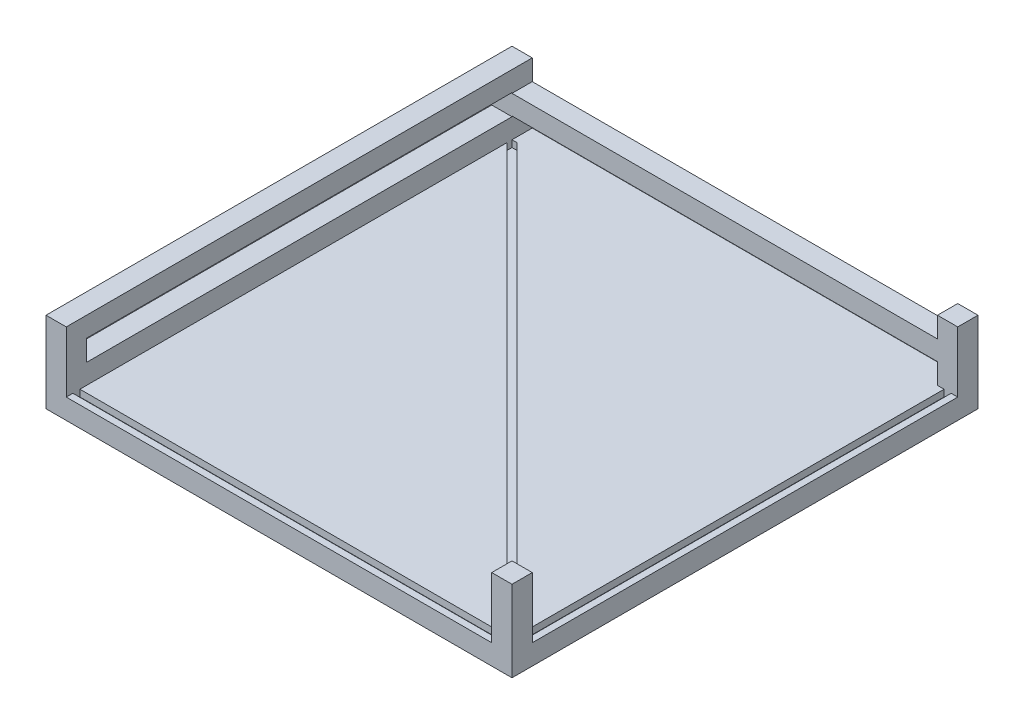
ISO-10303-21;
HEADER;
FILE_DESCRIPTION(('STEP AP214'),'2;1');
FILE_NAME('part.step','',(''),(''),'','','');
FILE_SCHEMA(('AUTOMOTIVE_DESIGN { 1 0 10303 214 1 1 1 1 }'));
ENDSEC;
DATA;
#1=APPLICATION_CONTEXT('core data for automotive mechanical design processes');
#2=APPLICATION_PROTOCOL_DEFINITION('international standard','automotive_design',2000,#1);
#3=PRODUCT_CONTEXT('',#1,'mechanical');
#4=PRODUCT('Part','Part','',(#3));
#5=PRODUCT_RELATED_PRODUCT_CATEGORY('part','',(#4));
#6=PRODUCT_DEFINITION_FORMATION('','',#4);
#7=PRODUCT_DEFINITION_CONTEXT('part definition',#1,'design');
#8=PRODUCT_DEFINITION('design','',#6,#7);
#9=PRODUCT_DEFINITION_SHAPE('','',#8);
#10=(LENGTH_UNIT() NAMED_UNIT(*) SI_UNIT(.MILLI.,.METRE.));
#11=(NAMED_UNIT(*) PLANE_ANGLE_UNIT() SI_UNIT($,.RADIAN.));
#12=(NAMED_UNIT(*) SI_UNIT($,.STERADIAN.) SOLID_ANGLE_UNIT());
#13=UNCERTAINTY_MEASURE_WITH_UNIT(LENGTH_MEASURE(1.E-05),#10,'distance_accuracy_value','');
#14=(GEOMETRIC_REPRESENTATION_CONTEXT(3) GLOBAL_UNCERTAINTY_ASSIGNED_CONTEXT((#13)) GLOBAL_UNIT_ASSIGNED_CONTEXT((#10,
#11,#12)) REPRESENTATION_CONTEXT('',''));
#15=CARTESIAN_POINT('',(0.,0.,0.));
#16=DIRECTION('',(0.,0.,1.));
#17=DIRECTION('',(1.,0.,0.));
#18=AXIS2_PLACEMENT_3D('',#15,#16,#17);
#19=CARTESIAN_POINT('',(0.,5.,0.));
#20=DIRECTION('',(0.,1.,0.));
#21=DIRECTION('',(0.,0.,1.));
#22=AXIS2_PLACEMENT_3D('',#19,#20,#21);
#23=PLANE('',#22);
#24=DIRECTION('',(0.707106781186548,0.,0.707106781186548));
#25=VECTOR('',#24,1.);
#26=CARTESIAN_POINT('',(-52.5,5.,-51.2649201555275));
#27=LINE('',#26,#25);
#28=CARTESIAN_POINT('',(-52.5,5.,-51.2649201555275));
#29=VERTEX_POINT('',#28);
#30=CARTESIAN_POINT('',(52.5,5.,53.7350798444725));
#31=VERTEX_POINT('',#30);
#32=EDGE_CURVE('E60',#29,#31,#27,.T.);
#33=ORIENTED_EDGE('',*,*,#32,.F.);
#34=DIRECTION('',(0.,0.,-1.));
#35=VECTOR('',#34,1.);
#36=CARTESIAN_POINT('',(-52.5,5.,0.));
#37=LINE('',#36,#35);
#38=CARTESIAN_POINT('',(-52.5,5.,54.1266666666667));
#39=VERTEX_POINT('',#38);
#40=EDGE_CURVE('E455',#39,#29,#37,.T.);
#41=ORIENTED_EDGE('',*,*,#40,.F.);
#42=DIRECTION('',(-1.,0.,0.));
#43=VECTOR('',#42,1.);
#44=CARTESIAN_POINT('',(52.5,5.,54.1266666666667));
#45=LINE('',#44,#43);
#46=CARTESIAN_POINT('',(52.5,5.,54.1266666666667));
#47=VERTEX_POINT('',#46);
#48=EDGE_CURVE('E324',#47,#39,#45,.T.);
#49=ORIENTED_EDGE('',*,*,#48,.F.);
#50=DIRECTION('',(0.,0.,-1.));
#51=VECTOR('',#50,1.);
#52=CARTESIAN_POINT('',(52.5,5.,57.5));
#53=LINE('',#52,#51);
#54=EDGE_CURVE('E371',#47,#31,#53,.T.);
#55=ORIENTED_EDGE('',*,*,#54,.T.);
#56=EDGE_LOOP('',(#33,#41,#49,#55));
#57=FACE_BOUND('',#56,.T.);
#58=ADVANCED_FACE('F45',(#57),#23,.T.);
#59=DIRECTION('',(-1.,0.,0.));
#60=VECTOR('',#59,1.);
#61=CARTESIAN_POINT('',(-52.5,5.,-52.5));
#62=LINE('',#61,#60);
#63=CARTESIAN_POINT('',(-51.2649201555275,5.,-52.5));
#64=VERTEX_POINT('',#63);
#65=CARTESIAN_POINT('',(-52.5,5.,-52.5));
#66=VERTEX_POINT('',#65);
#67=EDGE_CURVE('E287',#64,#66,#62,.T.);
#68=ORIENTED_EDGE('',*,*,#67,.F.);
#69=DIRECTION('',(-0.707106781186548,0.,-0.707106781186548));
#70=VECTOR('',#69,1.);
#71=CARTESIAN_POINT('',(53.7350798444725,5.,52.5));
#72=LINE('',#71,#70);
#73=CARTESIAN_POINT('',(53.7350798444725,5.,52.5));
#74=VERTEX_POINT('',#73);
#75=EDGE_CURVE('E297',#74,#64,#72,.T.);
#76=ORIENTED_EDGE('',*,*,#75,.F.);
#77=DIRECTION('',(-1.,0.,0.));
#78=VECTOR('',#77,1.);
#79=CARTESIAN_POINT('',(57.5,5.,52.5));
#80=LINE('',#79,#78);
#81=CARTESIAN_POINT('',(54.1266666666667,5.,52.5));
#82=VERTEX_POINT('',#81);
#83=EDGE_CURVE('E268',#82,#74,#80,.T.);
#84=ORIENTED_EDGE('',*,*,#83,.F.);
#85=DIRECTION('',(0.,0.,1.));
#86=VECTOR('',#85,1.);
#87=CARTESIAN_POINT('',(54.1266666666667,5.,-52.5));
#88=LINE('',#87,#86);
#89=CARTESIAN_POINT('',(54.1266666666667,5.,-52.5));
#90=VERTEX_POINT('',#89);
#91=EDGE_CURVE('E68',#90,#82,#88,.T.);
#92=ORIENTED_EDGE('',*,*,#91,.F.);
#93=DIRECTION('',(-1.,0.,0.));
#94=VECTOR('',#93,1.);
#95=CARTESIAN_POINT('',(57.5,5.,-52.5));
#96=LINE('',#95,#94);
#97=CARTESIAN_POINT('',(52.5,5.,-52.5));
#98=VERTEX_POINT('',#97);
#99=EDGE_CURVE('E389',#90,#98,#96,.T.);
#100=ORIENTED_EDGE('',*,*,#99,.T.);
#101=DIRECTION('',(0.,0.,-1.));
#102=VECTOR('',#101,1.);
#103=CARTESIAN_POINT('',(52.5,5.,-52.5));
#104=LINE('',#103,#102);
#105=CARTESIAN_POINT('',(52.5,5.,-57.5));
#106=VERTEX_POINT('',#105);
#107=EDGE_CURVE('E405',#98,#106,#104,.T.);
#108=ORIENTED_EDGE('',*,*,#107,.T.);
#109=DIRECTION('',(-1.,0.,0.));
#110=VECTOR('',#109,1.);
#111=CARTESIAN_POINT('',(-57.5,5.,-57.5));
#112=LINE('',#111,#110);
#113=CARTESIAN_POINT('',(-52.5,5.,-57.5));
#114=VERTEX_POINT('',#113);
#115=EDGE_CURVE('E495',#106,#114,#112,.T.);
#116=ORIENTED_EDGE('',*,*,#115,.T.);
#117=EDGE_CURVE('E450',#66,#114,#37,.T.);
#118=ORIENTED_EDGE('',*,*,#117,.F.);
#119=EDGE_LOOP('',(#68,#76,#84,#92,#100,#108,#116,#118));
#120=FACE_BOUND('',#119,.T.);
#121=ADVANCED_FACE('F558',(#120),#23,.T.);
#122=DIRECTION('',(1.,0.,0.));
#123=VECTOR('',#122,1.);
#124=CARTESIAN_POINT('',(52.5,5.,55.8733333333333));
#125=LINE('',#124,#123);
#126=CARTESIAN_POINT('',(-52.5,5.,55.8733333333333));
#127=VERTEX_POINT('',#126);
#128=CARTESIAN_POINT('',(52.5,5.,55.8733333333333));
#129=VERTEX_POINT('',#128);
#130=EDGE_CURVE('E343',#127,#129,#125,.T.);
#131=ORIENTED_EDGE('',*,*,#130,.F.);
#132=CARTESIAN_POINT('',(-52.5,5.,57.5));
#133=VERTEX_POINT('',#132);
#134=EDGE_CURVE('E451',#133,#127,#37,.T.);
#135=ORIENTED_EDGE('',*,*,#134,.F.);
#136=DIRECTION('',(1.,0.,0.));
#137=VECTOR('',#136,1.);
#138=CARTESIAN_POINT('',(-57.5,5.,57.5));
#139=LINE('',#138,#137);
#140=CARTESIAN_POINT('',(52.5,5.,57.5));
#141=VERTEX_POINT('',#140);
#142=EDGE_CURVE('E490',#133,#141,#139,.T.);
#143=ORIENTED_EDGE('',*,*,#142,.T.);
#144=EDGE_CURVE('E372',#141,#129,#53,.T.);
#145=ORIENTED_EDGE('',*,*,#144,.T.);
#146=EDGE_LOOP('',(#131,#135,#143,#145));
#147=FACE_BOUND('',#146,.T.);
#148=ADVANCED_FACE('F565',(#147),#23,.T.);
#149=DIRECTION('',(0.,0.,-1.));
#150=VECTOR('',#149,1.);
#151=CARTESIAN_POINT('',(55.8733333333333,5.,-52.5));
#152=LINE('',#151,#150);
#153=CARTESIAN_POINT('',(55.8733333333334,5.,52.5));
#154=VERTEX_POINT('',#153);
#155=CARTESIAN_POINT('',(55.8733333333333,5.,-52.5));
#156=VERTEX_POINT('',#155);
#157=EDGE_CURVE('E313',#154,#156,#152,.T.);
#158=ORIENTED_EDGE('',*,*,#157,.F.);
#159=CARTESIAN_POINT('',(57.5,5.,52.5));
#160=VERTEX_POINT('',#159);
#161=EDGE_CURVE('E368',#160,#154,#80,.T.);
#162=ORIENTED_EDGE('',*,*,#161,.F.);
#163=DIRECTION('',(0.,0.,-1.));
#164=VECTOR('',#163,1.);
#165=CARTESIAN_POINT('',(57.5,5.,-57.5));
#166=LINE('',#165,#164);
#167=CARTESIAN_POINT('',(57.5,5.,-52.5));
#168=VERTEX_POINT('',#167);
#169=EDGE_CURVE('E492',#160,#168,#166,.T.);
#170=ORIENTED_EDGE('',*,*,#169,.T.);
#171=EDGE_CURVE('E385',#168,#156,#96,.T.);
#172=ORIENTED_EDGE('',*,*,#171,.T.);
#173=EDGE_LOOP('',(#158,#162,#170,#172));
#174=FACE_BOUND('',#173,.T.);
#175=ADVANCED_FACE('F539',(#174),#23,.T.);
#176=CARTESIAN_POINT('',(-57.5,5.,-57.5));
#177=DIRECTION('',(1.,0.,0.));
#178=DIRECTION('',(0.,0.,-1.));
#179=AXIS2_PLACEMENT_3D('',#176,#177,#178);
#180=PLANE('',#179);
#181=DIRECTION('',(0.,-1.,0.));
#182=VECTOR('',#181,1.);
#183=CARTESIAN_POINT('',(-57.5,5.,-57.5));
#184=LINE('',#183,#182);
#185=CARTESIAN_POINT('',(-57.5,20.,-57.5));
#186=VERTEX_POINT('',#185);
#187=CARTESIAN_POINT('',(-57.5,0.,-57.5));
#188=VERTEX_POINT('',#187);
#189=EDGE_CURVE('E498',#186,#188,#184,.T.);
#190=ORIENTED_EDGE('',*,*,#189,.T.);
#191=DIRECTION('',(0.,0.,1.));
#192=VECTOR('',#191,1.);
#193=CARTESIAN_POINT('',(-57.5,0.,-57.5));
#194=LINE('',#193,#192);
#195=CARTESIAN_POINT('',(-57.5,0.,57.5));
#196=VERTEX_POINT('',#195);
#197=EDGE_CURVE('E478',#188,#196,#194,.T.);
#198=ORIENTED_EDGE('',*,*,#197,.T.);
#199=DIRECTION('',(0.,-1.,0.));
#200=VECTOR('',#199,1.);
#201=CARTESIAN_POINT('',(-57.5,5.,57.5));
#202=LINE('',#201,#200);
#203=CARTESIAN_POINT('',(-57.5,20.,57.5));
#204=VERTEX_POINT('',#203);
#205=EDGE_CURVE('E11',#204,#196,#202,.T.);
#206=ORIENTED_EDGE('',*,*,#205,.F.);
#207=DIRECTION('',(0.,0.,1.));
#208=VECTOR('',#207,1.);
#209=CARTESIAN_POINT('',(-57.5,20.,0.));
#210=LINE('',#209,#208);
#211=EDGE_CURVE('E441',#186,#204,#210,.T.);
#212=ORIENTED_EDGE('',*,*,#211,.F.);
#213=EDGE_LOOP('',(#190,#198,#206,#212));
#214=FACE_BOUND('',#213,.T.);
#215=DIRECTION('',(0.,1.,0.));
#216=VECTOR('',#215,1.);
#217=CARTESIAN_POINT('',(-57.5,0.,-52.5));
#218=LINE('',#217,#216);
#219=CARTESIAN_POINT('',(-57.5,9.92,-52.5));
#220=VERTEX_POINT('',#219);
#221=CARTESIAN_POINT('',(-57.5,15.08,-52.5));
#222=VERTEX_POINT('',#221);
#223=EDGE_CURVE('E468',#220,#222,#218,.T.);
#224=ORIENTED_EDGE('',*,*,#223,.T.);
#225=DIRECTION('',(0.,0.,1.));
#226=VECTOR('',#225,1.);
#227=CARTESIAN_POINT('',(-57.5,15.08,0.));
#228=LINE('',#227,#226);
#229=CARTESIAN_POINT('',(-57.5,15.08,52.5));
#230=VERTEX_POINT('',#229);
#231=EDGE_CURVE('E471',#222,#230,#228,.T.);
#232=ORIENTED_EDGE('',*,*,#231,.T.);
#233=DIRECTION('',(0.,1.,0.));
#234=VECTOR('',#233,1.);
#235=CARTESIAN_POINT('',(-57.5,0.,52.5));
#236=LINE('',#235,#234);
#237=CARTESIAN_POINT('',(-57.5,9.92,52.5));
#238=VERTEX_POINT('',#237);
#239=EDGE_CURVE('E423',#238,#230,#236,.T.);
#240=ORIENTED_EDGE('',*,*,#239,.F.);
#241=DIRECTION('',(0.,0.,1.));
#242=VECTOR('',#241,1.);
#243=CARTESIAN_POINT('',(-57.5,9.92,0.));
#244=LINE('',#243,#242);
#245=EDGE_CURVE('E466',#220,#238,#244,.T.);
#246=ORIENTED_EDGE('',*,*,#245,.F.);
#247=EDGE_LOOP('',(#224,#232,#240,#246));
#248=FACE_BOUND('',#247,.T.);
#249=ADVANCED_FACE('F47',(#214,#248),#180,.F.);
#250=CARTESIAN_POINT('',(-57.5,5.,57.5));
#251=DIRECTION('',(0.,0.,-1.));
#252=DIRECTION('',(-1.,0.,0.));
#253=AXIS2_PLACEMENT_3D('',#250,#251,#252);
#254=PLANE('',#253);
#255=DIRECTION('',(1.,0.,0.));
#256=VECTOR('',#255,1.);
#257=CARTESIAN_POINT('',(-57.5,0.,57.5));
#258=LINE('',#257,#256);
#259=CARTESIAN_POINT('',(57.5,0.,57.5));
#260=VERTEX_POINT('',#259);
#261=EDGE_CURVE('E501',#196,#260,#258,.T.);
#262=ORIENTED_EDGE('',*,*,#261,.T.);
#263=DIRECTION('',(0.,-1.,0.));
#264=VECTOR('',#263,1.);
#265=CARTESIAN_POINT('',(57.5,5.,57.5));
#266=LINE('',#265,#264);
#267=CARTESIAN_POINT('',(57.5,20.,57.5));
#268=VERTEX_POINT('',#267);
#269=EDGE_CURVE('E53',#268,#260,#266,.T.);
#270=ORIENTED_EDGE('',*,*,#269,.F.);
#271=DIRECTION('',(1.,0.,0.));
#272=VECTOR('',#271,1.);
#273=CARTESIAN_POINT('',(57.5,20.,57.5));
#274=LINE('',#273,#272);
#275=CARTESIAN_POINT('',(52.5,20.,57.5));
#276=VERTEX_POINT('',#275);
#277=EDGE_CURVE('E367',#276,#268,#274,.T.);
#278=ORIENTED_EDGE('',*,*,#277,.F.);
#279=DIRECTION('',(0.,-1.,0.));
#280=VECTOR('',#279,1.);
#281=CARTESIAN_POINT('',(52.5,27.0710678118655,57.5));
#282=LINE('',#281,#280);
#283=EDGE_CURVE('E375',#276,#141,#282,.T.);
#284=ORIENTED_EDGE('',*,*,#283,.T.);
#285=ORIENTED_EDGE('',*,*,#142,.F.);
#286=DIRECTION('',(0.,1.,0.));
#287=VECTOR('',#286,1.);
#288=CARTESIAN_POINT('',(-52.5,0.,57.5));
#289=LINE('',#288,#287);
#290=CARTESIAN_POINT('',(-52.5,20.,57.5));
#291=VERTEX_POINT('',#290);
#292=EDGE_CURVE('E454',#133,#291,#289,.T.);
#293=ORIENTED_EDGE('',*,*,#292,.T.);
#294=DIRECTION('',(-1.,0.,0.));
#295=VECTOR('',#294,1.);
#296=CARTESIAN_POINT('',(-52.5,20.,57.5));
#297=LINE('',#296,#295);
#298=EDGE_CURVE('E479',#291,#204,#297,.T.);
#299=ORIENTED_EDGE('',*,*,#298,.T.);
#300=ORIENTED_EDGE('',*,*,#205,.T.);
#301=EDGE_LOOP('',(#262,#270,#278,#284,#285,#293,#299,#300));
#302=FACE_BOUND('',#301,.T.);
#303=ADVANCED_FACE('F548',(#302),#254,.F.);
#304=CARTESIAN_POINT('',(57.5,5.,-57.5));
#305=DIRECTION('',(-1.,0.,0.));
#306=DIRECTION('',(0.,0.,1.));
#307=AXIS2_PLACEMENT_3D('',#304,#305,#306);
#308=PLANE('',#307);
#309=DIRECTION('',(0.,0.,-1.));
#310=VECTOR('',#309,1.);
#311=CARTESIAN_POINT('',(57.5,0.,-57.5));
#312=LINE('',#311,#310);
#313=CARTESIAN_POINT('',(57.5,0.,-57.5));
#314=VERTEX_POINT('',#313);
#315=EDGE_CURVE('E503',#260,#314,#312,.T.);
#316=ORIENTED_EDGE('',*,*,#315,.T.);
#317=DIRECTION('',(0.,-1.,0.));
#318=VECTOR('',#317,1.);
#319=CARTESIAN_POINT('',(57.5,5.,-57.5));
#320=LINE('',#319,#318);
#321=CARTESIAN_POINT('',(57.5,20.,-57.5));
#322=VERTEX_POINT('',#321);
#323=EDGE_CURVE('E508',#322,#314,#320,.T.);
#324=ORIENTED_EDGE('',*,*,#323,.F.);
#325=DIRECTION('',(0.,0.,-1.));
#326=VECTOR('',#325,1.);
#327=CARTESIAN_POINT('',(57.5,20.,-52.5));
#328=LINE('',#327,#326);
#329=CARTESIAN_POINT('',(57.5,20.,-52.5));
#330=VERTEX_POINT('',#329);
#331=EDGE_CURVE('E420',#330,#322,#328,.T.);
#332=ORIENTED_EDGE('',*,*,#331,.F.);
#333=DIRECTION('',(0.,1.,0.));
#334=VECTOR('',#333,1.);
#335=CARTESIAN_POINT('',(57.5,5.,-52.5));
#336=LINE('',#335,#334);
#337=EDGE_CURVE('E403',#168,#330,#336,.T.);
#338=ORIENTED_EDGE('',*,*,#337,.F.);
#339=ORIENTED_EDGE('',*,*,#169,.F.);
#340=DIRECTION('',(0.,-1.,0.));
#341=VECTOR('',#340,1.);
#342=CARTESIAN_POINT('',(57.5,27.0710678118655,52.5));
#343=LINE('',#342,#341);
#344=CARTESIAN_POINT('',(57.5,20.,52.5));
#345=VERTEX_POINT('',#344);
#346=EDGE_CURVE('E361',#345,#160,#343,.T.);
#347=ORIENTED_EDGE('',*,*,#346,.F.);
#348=DIRECTION('',(0.,0.,1.));
#349=VECTOR('',#348,1.);
#350=CARTESIAN_POINT('',(57.5,20.,57.5));
#351=LINE('',#350,#349);
#352=EDGE_CURVE('E364',#345,#268,#351,.T.);
#353=ORIENTED_EDGE('',*,*,#352,.T.);
#354=ORIENTED_EDGE('',*,*,#269,.T.);
#355=EDGE_LOOP('',(#316,#324,#332,#338,#339,#347,#353,#354));
#356=FACE_BOUND('',#355,.T.);
#357=ADVANCED_FACE('F513',(#356),#308,.F.);
#358=CARTESIAN_POINT('',(-57.5,5.,-57.5));
#359=DIRECTION('',(0.,0.,1.));
#360=DIRECTION('',(1.,0.,0.));
#361=AXIS2_PLACEMENT_3D('',#358,#359,#360);
#362=PLANE('',#361);
#363=DIRECTION('',(0.,1.,0.));
#364=VECTOR('',#363,1.);
#365=CARTESIAN_POINT('',(-52.5,0.,-57.5));
#366=LINE('',#365,#364);
#367=CARTESIAN_POINT('',(-52.5,10.08,-57.5));
#368=VERTEX_POINT('',#367);
#369=EDGE_CURVE('E461',#114,#368,#366,.T.);
#370=ORIENTED_EDGE('',*,*,#369,.F.);
#371=ORIENTED_EDGE('',*,*,#115,.F.);
#372=DIRECTION('',(0.,-1.,0.));
#373=VECTOR('',#372,1.);
#374=CARTESIAN_POINT('',(52.5,10.08,-57.5));
#375=LINE('',#374,#373);
#376=CARTESIAN_POINT('',(52.5,10.08,-57.5));
#377=VERTEX_POINT('',#376);
#378=EDGE_CURVE('E384',#377,#106,#375,.T.);
#379=ORIENTED_EDGE('',*,*,#378,.F.);
#380=DIRECTION('',(-1.,0.,0.));
#381=VECTOR('',#380,1.);
#382=CARTESIAN_POINT('',(52.5,10.08,-57.5));
#383=LINE('',#382,#381);
#384=EDGE_CURVE('E408',#377,#368,#383,.T.);
#385=ORIENTED_EDGE('',*,*,#384,.T.);
#386=EDGE_LOOP('',(#370,#371,#379,#385));
#387=FACE_BOUND('',#386,.T.);
#388=DIRECTION('',(-1.,0.,0.));
#389=VECTOR('',#388,1.);
#390=CARTESIAN_POINT('',(-57.5,0.,-57.5));
#391=LINE('',#390,#389);
#392=EDGE_CURVE('E493',#314,#188,#391,.T.);
#393=ORIENTED_EDGE('',*,*,#392,.T.);
#394=ORIENTED_EDGE('',*,*,#189,.F.);
#395=DIRECTION('',(-1.,0.,0.));
#396=VECTOR('',#395,1.);
#397=CARTESIAN_POINT('',(-52.5,20.,-57.5));
#398=LINE('',#397,#396);
#399=CARTESIAN_POINT('',(-52.5,20.,-57.5));
#400=VERTEX_POINT('',#399);
#401=EDGE_CURVE('E475',#400,#186,#398,.T.);
#402=ORIENTED_EDGE('',*,*,#401,.F.);
#403=CARTESIAN_POINT('',(-52.5,14.92,-57.5));
#404=VERTEX_POINT('',#403);
#405=EDGE_CURVE('E460',#404,#400,#366,.T.);
#406=ORIENTED_EDGE('',*,*,#405,.F.);
#407=DIRECTION('',(-1.,0.,0.));
#408=VECTOR('',#407,1.);
#409=CARTESIAN_POINT('',(52.5,14.92,-57.5));
#410=LINE('',#409,#408);
#411=CARTESIAN_POINT('',(52.5,14.92,-57.5));
#412=VERTEX_POINT('',#411);
#413=EDGE_CURVE('E411',#412,#404,#410,.T.);
#414=ORIENTED_EDGE('',*,*,#413,.F.);
#415=DIRECTION('',(0.,1.,0.));
#416=VECTOR('',#415,1.);
#417=CARTESIAN_POINT('',(52.5,14.92,-57.5));
#418=LINE('',#417,#416);
#419=CARTESIAN_POINT('',(52.5,20.,-57.5));
#420=VERTEX_POINT('',#419);
#421=EDGE_CURVE('E414',#412,#420,#418,.T.);
#422=ORIENTED_EDGE('',*,*,#421,.T.);
#423=DIRECTION('',(-1.,0.,0.));
#424=VECTOR('',#423,1.);
#425=CARTESIAN_POINT('',(57.5,20.,-57.5));
#426=LINE('',#425,#424);
#427=EDGE_CURVE('E417',#322,#420,#426,.T.);
#428=ORIENTED_EDGE('',*,*,#427,.F.);
#429=ORIENTED_EDGE('',*,*,#323,.T.);
#430=EDGE_LOOP('',(#393,#394,#402,#406,#414,#422,#428,#429));
#431=FACE_BOUND('',#430,.T.);
#432=ADVANCED_FACE('F522',(#387,#431),#362,.F.);
#433=CARTESIAN_POINT('',(0.,0.,0.));
#434=DIRECTION('',(0.,1.,0.));
#435=DIRECTION('',(0.,0.,1.));
#436=AXIS2_PLACEMENT_3D('',#433,#434,#435);
#437=PLANE('',#436);
#438=ORIENTED_EDGE('',*,*,#197,.F.);
#439=ORIENTED_EDGE('',*,*,#392,.F.);
#440=ORIENTED_EDGE('',*,*,#315,.F.);
#441=ORIENTED_EDGE('',*,*,#261,.F.);
#442=EDGE_LOOP('',(#438,#439,#440,#441));
#443=FACE_BOUND('',#442,.T.);
#444=ADVANCED_FACE('F520',(#443),#437,.F.);
#445=CARTESIAN_POINT('',(-52.5,20.,0.));
#446=DIRECTION('',(0.,-1.,0.));
#447=DIRECTION('',(0.,0.,-1.));
#448=AXIS2_PLACEMENT_3D('',#445,#446,#447);
#449=PLANE('',#448);
#450=ORIENTED_EDGE('',*,*,#298,.F.);
#451=DIRECTION('',(0.,0.,1.));
#452=VECTOR('',#451,1.);
#453=CARTESIAN_POINT('',(-52.5,20.,0.));
#454=LINE('',#453,#452);
#455=EDGE_CURVE('E458',#400,#291,#454,.T.);
#456=ORIENTED_EDGE('',*,*,#455,.F.);
#457=ORIENTED_EDGE('',*,*,#401,.T.);
#458=ORIENTED_EDGE('',*,*,#211,.T.);
#459=EDGE_LOOP('',(#450,#456,#457,#458));
#460=FACE_BOUND('',#459,.T.);
#461=ADVANCED_FACE('F588',(#460),#449,.F.);
#462=CARTESIAN_POINT('',(-52.5,0.,52.5));
#463=DIRECTION('',(0.,0.,1.));
#464=DIRECTION('',(1.,0.,0.));
#465=AXIS2_PLACEMENT_3D('',#462,#463,#464);
#466=PLANE('',#465);
#467=ORIENTED_EDGE('',*,*,#239,.T.);
#468=DIRECTION('',(-1.,0.,0.));
#469=VECTOR('',#468,1.);
#470=CARTESIAN_POINT('',(-52.5,15.08,52.5));
#471=LINE('',#470,#469);
#472=CARTESIAN_POINT('',(-52.5,15.08,52.5));
#473=VERTEX_POINT('',#472);
#474=EDGE_CURVE('E482',#473,#230,#471,.T.);
#475=ORIENTED_EDGE('',*,*,#474,.F.);
#476=DIRECTION('',(0.,1.,0.));
#477=VECTOR('',#476,1.);
#478=CARTESIAN_POINT('',(-52.5,0.,52.5));
#479=LINE('',#478,#477);
#480=CARTESIAN_POINT('',(-52.5,9.92,52.5));
#481=VERTEX_POINT('',#480);
#482=EDGE_CURVE('E438',#481,#473,#479,.T.);
#483=ORIENTED_EDGE('',*,*,#482,.F.);
#484=DIRECTION('',(-1.,0.,0.));
#485=VECTOR('',#484,1.);
#486=CARTESIAN_POINT('',(-52.5,9.92,52.5));
#487=LINE('',#486,#485);
#488=EDGE_CURVE('E463',#481,#238,#487,.T.);
#489=ORIENTED_EDGE('',*,*,#488,.T.);
#490=EDGE_LOOP('',(#467,#475,#483,#489));
#491=FACE_BOUND('',#490,.T.);
#492=ADVANCED_FACE('F601',(#491),#466,.F.);
#493=CARTESIAN_POINT('',(-52.5,15.08,0.));
#494=DIRECTION('',(0.,-1.,0.));
#495=DIRECTION('',(0.,0.,-1.));
#496=AXIS2_PLACEMENT_3D('',#493,#494,#495);
#497=PLANE('',#496);
#498=ORIENTED_EDGE('',*,*,#231,.F.);
#499=DIRECTION('',(-1.,0.,0.));
#500=VECTOR('',#499,1.);
#501=CARTESIAN_POINT('',(-52.5,15.08,-52.5));
#502=LINE('',#501,#500);
#503=CARTESIAN_POINT('',(-52.5,15.08,-52.5));
#504=VERTEX_POINT('',#503);
#505=EDGE_CURVE('E484',#504,#222,#502,.T.);
#506=ORIENTED_EDGE('',*,*,#505,.F.);
#507=DIRECTION('',(0.,0.,1.));
#508=VECTOR('',#507,1.);
#509=CARTESIAN_POINT('',(-52.5,15.08,0.));
#510=LINE('',#509,#508);
#511=EDGE_CURVE('E447',#504,#473,#510,.T.);
#512=ORIENTED_EDGE('',*,*,#511,.T.);
#513=ORIENTED_EDGE('',*,*,#474,.T.);
#514=EDGE_LOOP('',(#498,#506,#512,#513));
#515=FACE_BOUND('',#514,.T.);
#516=ADVANCED_FACE('F596',(#515),#497,.T.);
#517=CARTESIAN_POINT('',(-52.5,0.,-52.5));
#518=DIRECTION('',(0.,0.,1.));
#519=DIRECTION('',(1.,0.,0.));
#520=AXIS2_PLACEMENT_3D('',#517,#518,#519);
#521=PLANE('',#520);
#522=ORIENTED_EDGE('',*,*,#223,.F.);
#523=DIRECTION('',(-1.,0.,0.));
#524=VECTOR('',#523,1.);
#525=CARTESIAN_POINT('',(-52.5,9.92,-52.5));
#526=LINE('',#525,#524);
#527=CARTESIAN_POINT('',(-52.5,9.92,-52.5));
#528=VERTEX_POINT('',#527);
#529=EDGE_CURVE('E486',#528,#220,#526,.T.);
#530=ORIENTED_EDGE('',*,*,#529,.F.);
#531=DIRECTION('',(0.,1.,0.));
#532=VECTOR('',#531,1.);
#533=CARTESIAN_POINT('',(-52.5,0.,-52.5));
#534=LINE('',#533,#532);
#535=CARTESIAN_POINT('',(-52.5,10.08,-52.5));
#536=VERTEX_POINT('',#535);
#537=EDGE_CURVE('E444',#528,#536,#534,.T.);
#538=ORIENTED_EDGE('',*,*,#537,.T.);
#539=DIRECTION('',(-1.,0.,0.));
#540=VECTOR('',#539,1.);
#541=CARTESIAN_POINT('',(52.5,10.08,-52.5));
#542=LINE('',#541,#540);
#543=CARTESIAN_POINT('',(52.5,10.08,-52.5));
#544=VERTEX_POINT('',#543);
#545=EDGE_CURVE('E392',#544,#536,#542,.T.);
#546=ORIENTED_EDGE('',*,*,#545,.F.);
#547=DIRECTION('',(0.,-1.,0.));
#548=VECTOR('',#547,1.);
#549=CARTESIAN_POINT('',(52.5,10.08,-52.5));
#550=LINE('',#549,#548);
#551=EDGE_CURVE('E388',#544,#98,#550,.T.);
#552=ORIENTED_EDGE('',*,*,#551,.T.);
#553=ORIENTED_EDGE('',*,*,#99,.F.);
#554=DIRECTION('',(0.,1.,0.));
#555=VECTOR('',#554,1.);
#556=CARTESIAN_POINT('',(54.1266666666667,3.33333333333333,-52.5));
#557=LINE('',#556,#555);
#558=CARTESIAN_POINT('',(54.1266666666667,3.33333333333333,-52.5));
#559=VERTEX_POINT('',#558);
#560=EDGE_CURVE('E327',#559,#90,#557,.T.);
#561=ORIENTED_EDGE('',*,*,#560,.F.);
#562=DIRECTION('',(-1.,0.,0.));
#563=VECTOR('',#562,1.);
#564=CARTESIAN_POINT('',(54.1266666666667,3.33333333333333,-52.5));
#565=LINE('',#564,#563);
#566=CARTESIAN_POINT('',(55.8733333333333,3.33333333333333,-52.5));
#567=VERTEX_POINT('',#566);
#568=EDGE_CURVE('E319',#567,#559,#565,.T.);
#569=ORIENTED_EDGE('',*,*,#568,.F.);
#570=DIRECTION('',(0.,1.,0.));
#571=VECTOR('',#570,1.);
#572=CARTESIAN_POINT('',(55.8733333333333,3.33333333333333,-52.5));
#573=LINE('',#572,#571);
#574=EDGE_CURVE('E329',#567,#156,#573,.T.);
#575=ORIENTED_EDGE('',*,*,#574,.T.);
#576=ORIENTED_EDGE('',*,*,#171,.F.);
#577=ORIENTED_EDGE('',*,*,#337,.T.);
#578=DIRECTION('',(-1.,0.,0.));
#579=VECTOR('',#578,1.);
#580=CARTESIAN_POINT('',(57.5,20.,-52.5));
#581=LINE('',#580,#579);
#582=CARTESIAN_POINT('',(52.5,20.,-52.5));
#583=VERTEX_POINT('',#582);
#584=EDGE_CURVE('E401',#330,#583,#581,.T.);
#585=ORIENTED_EDGE('',*,*,#584,.T.);
#586=DIRECTION('',(0.,1.,0.));
#587=VECTOR('',#586,1.);
#588=CARTESIAN_POINT('',(52.5,14.92,-52.5));
#589=LINE('',#588,#587);
#590=CARTESIAN_POINT('',(52.5,14.92,-52.5));
#591=VERTEX_POINT('',#590);
#592=EDGE_CURVE('E398',#591,#583,#589,.T.);
#593=ORIENTED_EDGE('',*,*,#592,.F.);
#594=DIRECTION('',(-1.,0.,0.));
#595=VECTOR('',#594,1.);
#596=CARTESIAN_POINT('',(52.5,14.92,-52.5));
#597=LINE('',#596,#595);
#598=CARTESIAN_POINT('',(-52.5,14.92,-52.5));
#599=VERTEX_POINT('',#598);
#600=EDGE_CURVE('E395',#591,#599,#597,.T.);
#601=ORIENTED_EDGE('',*,*,#600,.T.);
#602=EDGE_CURVE('E443',#599,#504,#534,.T.);
#603=ORIENTED_EDGE('',*,*,#602,.T.);
#604=ORIENTED_EDGE('',*,*,#505,.T.);
#605=EDGE_LOOP('',(#522,#530,#538,#546,#552,#553,#561,#569,#575,#576,#577,#585,#593,#601,#603,#604));
#606=FACE_BOUND('',#605,.T.);
#607=ADVANCED_FACE('F534',(#606),#521,.T.);
#608=CARTESIAN_POINT('',(-52.5,9.92,0.));
#609=DIRECTION('',(0.,-1.,0.));
#610=DIRECTION('',(0.,0.,-1.));
#611=AXIS2_PLACEMENT_3D('',#608,#609,#610);
#612=PLANE('',#611);
#613=ORIENTED_EDGE('',*,*,#245,.T.);
#614=ORIENTED_EDGE('',*,*,#488,.F.);
#615=DIRECTION('',(0.,0.,1.));
#616=VECTOR('',#615,1.);
#617=CARTESIAN_POINT('',(-52.5,9.92,0.));
#618=LINE('',#617,#616);
#619=EDGE_CURVE('E440',#528,#481,#618,.T.);
#620=ORIENTED_EDGE('',*,*,#619,.F.);
#621=ORIENTED_EDGE('',*,*,#529,.T.);
#622=EDGE_LOOP('',(#613,#614,#620,#621));
#623=FACE_BOUND('',#622,.T.);
#624=ADVANCED_FACE('F605',(#623),#612,.F.);
#625=CARTESIAN_POINT('',(-52.5,0.,0.));
#626=DIRECTION('',(-1.,0.,0.));
#627=DIRECTION('',(0.,0.,1.));
#628=AXIS2_PLACEMENT_3D('',#625,#626,#627);
#629=PLANE('',#628);
#630=ORIENTED_EDGE('',*,*,#134,.T.);
#631=DIRECTION('',(0.,1.,0.));
#632=VECTOR('',#631,1.);
#633=CARTESIAN_POINT('',(-52.5,3.33333333333333,55.8733333333333));
#634=LINE('',#633,#632);
#635=CARTESIAN_POINT('',(-52.5,3.33333333333333,55.8733333333333));
#636=VERTEX_POINT('',#635);
#637=EDGE_CURVE('E339',#636,#127,#634,.T.);
#638=ORIENTED_EDGE('',*,*,#637,.F.);
#639=DIRECTION('',(0.,0.,1.));
#640=VECTOR('',#639,1.);
#641=CARTESIAN_POINT('',(-52.5,3.33333333333333,54.1266666666667));
#642=LINE('',#641,#640);
#643=CARTESIAN_POINT('',(-52.5,3.33333333333333,54.1266666666667));
#644=VERTEX_POINT('',#643);
#645=EDGE_CURVE('E350',#644,#636,#642,.T.);
#646=ORIENTED_EDGE('',*,*,#645,.F.);
#647=DIRECTION('',(0.,1.,0.));
#648=VECTOR('',#647,1.);
#649=CARTESIAN_POINT('',(-52.5,3.33333333333333,54.1266666666667));
#650=LINE('',#649,#648);
#651=EDGE_CURVE('E337',#644,#39,#650,.T.);
#652=ORIENTED_EDGE('',*,*,#651,.T.);
#653=ORIENTED_EDGE('',*,*,#40,.T.);
#654=DIRECTION('',(0.,1.,0.));
#655=VECTOR('',#654,1.);
#656=CARTESIAN_POINT('',(-52.5,3.33,-51.2649201555275));
#657=LINE('',#656,#655);
#658=CARTESIAN_POINT('',(-52.5,3.33,-51.2649201555275));
#659=VERTEX_POINT('',#658);
#660=EDGE_CURVE('E304',#659,#29,#657,.T.);
#661=ORIENTED_EDGE('',*,*,#660,.F.);
#662=DIRECTION('',(0.,0.,1.));
#663=VECTOR('',#662,1.);
#664=CARTESIAN_POINT('',(-52.5,3.33,-51.2649201555275));
#665=LINE('',#664,#663);
#666=CARTESIAN_POINT('',(-52.5,3.33,-52.5));
#667=VERTEX_POINT('',#666);
#668=EDGE_CURVE('E291',#667,#659,#665,.T.);
#669=ORIENTED_EDGE('',*,*,#668,.F.);
#670=DIRECTION('',(0.,1.,0.));
#671=VECTOR('',#670,1.);
#672=CARTESIAN_POINT('',(-52.5,3.33,-52.5));
#673=LINE('',#672,#671);
#674=EDGE_CURVE('E306',#667,#66,#673,.T.);
#675=ORIENTED_EDGE('',*,*,#674,.T.);
#676=ORIENTED_EDGE('',*,*,#117,.T.);
#677=ORIENTED_EDGE('',*,*,#369,.T.);
#678=DIRECTION('',(0.,0.,-1.));
#679=VECTOR('',#678,1.);
#680=CARTESIAN_POINT('',(-52.5,10.08,-52.5));
#681=LINE('',#680,#679);
#682=EDGE_CURVE('E431',#536,#368,#681,.T.);
#683=ORIENTED_EDGE('',*,*,#682,.F.);
#684=ORIENTED_EDGE('',*,*,#537,.F.);
#685=ORIENTED_EDGE('',*,*,#619,.T.);
#686=ORIENTED_EDGE('',*,*,#482,.T.);
#687=ORIENTED_EDGE('',*,*,#511,.F.);
#688=ORIENTED_EDGE('',*,*,#602,.F.);
#689=DIRECTION('',(0.,0.,-1.));
#690=VECTOR('',#689,1.);
#691=CARTESIAN_POINT('',(-52.5,14.92,-52.5));
#692=LINE('',#691,#690);
#693=EDGE_CURVE('E428',#599,#404,#692,.T.);
#694=ORIENTED_EDGE('',*,*,#693,.T.);
#695=ORIENTED_EDGE('',*,*,#405,.T.);
#696=ORIENTED_EDGE('',*,*,#455,.T.);
#697=ORIENTED_EDGE('',*,*,#292,.F.);
#698=EDGE_LOOP('',(#630,#638,#646,#652,#653,#661,#669,#675,#676,#677,#683,#684,#685,#686,#687,
#688,#694,#695,#696,#697));
#699=FACE_BOUND('',#698,.T.);
#700=ADVANCED_FACE('F582',(#699),#629,.F.);
#701=CARTESIAN_POINT('',(57.5,20.,-52.5));
#702=DIRECTION('',(0.,-1.,0.));
#703=DIRECTION('',(1.,0.,0.));
#704=AXIS2_PLACEMENT_3D('',#701,#702,#703);
#705=PLANE('',#704);
#706=ORIENTED_EDGE('',*,*,#427,.T.);
#707=DIRECTION('',(0.,0.,-1.));
#708=VECTOR('',#707,1.);
#709=CARTESIAN_POINT('',(52.5,20.,-52.5));
#710=LINE('',#709,#708);
#711=EDGE_CURVE('E424',#583,#420,#710,.T.);
#712=ORIENTED_EDGE('',*,*,#711,.F.);
#713=ORIENTED_EDGE('',*,*,#584,.F.);
#714=ORIENTED_EDGE('',*,*,#331,.T.);
#715=EDGE_LOOP('',(#706,#712,#713,#714));
#716=FACE_BOUND('',#715,.T.);
#717=ADVANCED_FACE('F529',(#716),#705,.F.);
#718=CARTESIAN_POINT('',(52.5,14.92,-52.5));
#719=DIRECTION('',(-1.,0.,0.));
#720=DIRECTION('',(0.,0.,1.));
#721=AXIS2_PLACEMENT_3D('',#718,#719,#720);
#722=PLANE('',#721);
#723=ORIENTED_EDGE('',*,*,#421,.F.);
#724=DIRECTION('',(0.,0.,-1.));
#725=VECTOR('',#724,1.);
#726=CARTESIAN_POINT('',(52.5,14.92,-52.5));
#727=LINE('',#726,#725);
#728=EDGE_CURVE('E426',#591,#412,#727,.T.);
#729=ORIENTED_EDGE('',*,*,#728,.F.);
#730=ORIENTED_EDGE('',*,*,#592,.T.);
#731=ORIENTED_EDGE('',*,*,#711,.T.);
#732=EDGE_LOOP('',(#723,#729,#730,#731));
#733=FACE_BOUND('',#732,.T.);
#734=ADVANCED_FACE('F657',(#733),#722,.T.);
#735=CARTESIAN_POINT('',(52.5,14.92,-52.5));
#736=DIRECTION('',(0.,-1.,0.));
#737=DIRECTION('',(0.,0.,-1.));
#738=AXIS2_PLACEMENT_3D('',#735,#736,#737);
#739=PLANE('',#738);
#740=ORIENTED_EDGE('',*,*,#413,.T.);
#741=ORIENTED_EDGE('',*,*,#693,.F.);
#742=ORIENTED_EDGE('',*,*,#600,.F.);
#743=ORIENTED_EDGE('',*,*,#728,.T.);
#744=EDGE_LOOP('',(#740,#741,#742,#743));
#745=FACE_BOUND('',#744,.T.);
#746=ADVANCED_FACE('F660',(#745),#739,.F.);
#747=CARTESIAN_POINT('',(52.5,10.08,-52.5));
#748=DIRECTION('',(0.,-1.,0.));
#749=DIRECTION('',(0.,0.,-1.));
#750=AXIS2_PLACEMENT_3D('',#747,#748,#749);
#751=PLANE('',#750);
#752=ORIENTED_EDGE('',*,*,#384,.F.);
#753=DIRECTION('',(0.,0.,-1.));
#754=VECTOR('',#753,1.);
#755=CARTESIAN_POINT('',(52.5,10.08,-52.5));
#756=LINE('',#755,#754);
#757=EDGE_CURVE('E434',#544,#377,#756,.T.);
#758=ORIENTED_EDGE('',*,*,#757,.F.);
#759=ORIENTED_EDGE('',*,*,#545,.T.);
#760=ORIENTED_EDGE('',*,*,#682,.T.);
#761=EDGE_LOOP('',(#752,#758,#759,#760));
#762=FACE_BOUND('',#761,.T.);
#763=ADVANCED_FACE('F610',(#762),#751,.T.);
#764=CARTESIAN_POINT('',(52.5,10.08,-52.5));
#765=DIRECTION('',(1.,0.,0.));
#766=DIRECTION('',(0.,0.,-1.));
#767=AXIS2_PLACEMENT_3D('',#764,#765,#766);
#768=PLANE('',#767);
#769=ORIENTED_EDGE('',*,*,#378,.T.);
#770=ORIENTED_EDGE('',*,*,#107,.F.);
#771=ORIENTED_EDGE('',*,*,#551,.F.);
#772=ORIENTED_EDGE('',*,*,#757,.T.);
#773=EDGE_LOOP('',(#769,#770,#771,#772));
#774=FACE_BOUND('',#773,.T.);
#775=ADVANCED_FACE('F615',(#774),#768,.F.);
#776=CARTESIAN_POINT('',(57.5,27.0710678118655,52.5));
#777=DIRECTION('',(0.,0.,1.));
#778=DIRECTION('',(1.,0.,0.));
#779=AXIS2_PLACEMENT_3D('',#776,#777,#778);
#780=PLANE('',#779);
#781=DIRECTION('',(0.,-1.,0.));
#782=VECTOR('',#781,1.);
#783=CARTESIAN_POINT('',(52.5,27.0710678118655,52.5));
#784=LINE('',#783,#782);
#785=CARTESIAN_POINT('',(52.5,20.,52.5));
#786=VERTEX_POINT('',#785);
#787=CARTESIAN_POINT('',(52.5,3.33,52.5));
#788=VERTEX_POINT('',#787);
#789=EDGE_CURVE('E378',#786,#788,#784,.T.);
#790=ORIENTED_EDGE('',*,*,#789,.F.);
#791=DIRECTION('',(1.,0.,0.));
#792=VECTOR('',#791,1.);
#793=CARTESIAN_POINT('',(57.5,20.,52.5));
#794=LINE('',#793,#792);
#795=EDGE_CURVE('E360',#786,#345,#794,.T.);
#796=ORIENTED_EDGE('',*,*,#795,.T.);
#797=ORIENTED_EDGE('',*,*,#346,.T.);
#798=ORIENTED_EDGE('',*,*,#161,.T.);
#799=DIRECTION('',(0.,1.,0.));
#800=VECTOR('',#799,1.);
#801=CARTESIAN_POINT('',(55.8733333333334,3.33333333333333,52.5));
#802=LINE('',#801,#800);
#803=CARTESIAN_POINT('',(55.8733333333334,3.33333333333333,52.5));
#804=VERTEX_POINT('',#803);
#805=EDGE_CURVE('E331',#804,#154,#802,.T.);
#806=ORIENTED_EDGE('',*,*,#805,.F.);
#807=DIRECTION('',(1.,0.,0.));
#808=VECTOR('',#807,1.);
#809=CARTESIAN_POINT('',(54.1266666666667,3.33333333333333,52.5));
#810=LINE('',#809,#808);
#811=CARTESIAN_POINT('',(54.1266666666667,3.33333333333333,52.5));
#812=VERTEX_POINT('',#811);
#813=EDGE_CURVE('E312',#812,#804,#810,.T.);
#814=ORIENTED_EDGE('',*,*,#813,.F.);
#815=DIRECTION('',(0.,1.,0.));
#816=VECTOR('',#815,1.);
#817=CARTESIAN_POINT('',(54.1266666666667,3.33333333333333,52.5));
#818=LINE('',#817,#816);
#819=EDGE_CURVE('E322',#812,#82,#818,.T.);
#820=ORIENTED_EDGE('',*,*,#819,.T.);
#821=ORIENTED_EDGE('',*,*,#83,.T.);
#822=DIRECTION('',(0.,1.,0.));
#823=VECTOR('',#822,1.);
#824=CARTESIAN_POINT('',(53.7350798444725,3.33,52.5));
#825=LINE('',#824,#823);
#826=CARTESIAN_POINT('',(53.7350798444725,3.33,52.5));
#827=VERTEX_POINT('',#826);
#828=EDGE_CURVE('E260',#827,#74,#825,.T.);
#829=ORIENTED_EDGE('',*,*,#828,.F.);
#830=DIRECTION('',(1.,0.,0.));
#831=VECTOR('',#830,1.);
#832=CARTESIAN_POINT('',(52.5,3.33,52.5));
#833=LINE('',#832,#831);
#834=EDGE_CURVE('E265',#788,#827,#833,.T.);
#835=ORIENTED_EDGE('',*,*,#834,.F.);
#836=EDGE_LOOP('',(#790,#796,#797,#798,#806,#814,#820,#821,#829,#835));
#837=FACE_BOUND('',#836,.T.);
#838=ADVANCED_FACE('F263',(#837),#780,.F.);
#839=CARTESIAN_POINT('',(52.5,27.0710678118655,57.5));
#840=DIRECTION('',(-1.,0.,0.));
#841=DIRECTION('',(0.,0.,1.));
#842=AXIS2_PLACEMENT_3D('',#839,#840,#841);
#843=PLANE('',#842);
#844=DIRECTION('',(0.,0.,1.));
#845=VECTOR('',#844,1.);
#846=CARTESIAN_POINT('',(52.5,20.,57.5));
#847=LINE('',#846,#845);
#848=EDGE_CURVE('E358',#786,#276,#847,.T.);
#849=ORIENTED_EDGE('',*,*,#848,.F.);
#850=ORIENTED_EDGE('',*,*,#789,.T.);
#851=DIRECTION('',(0.,0.,-1.));
#852=VECTOR('',#851,1.);
#853=CARTESIAN_POINT('',(52.5,3.33,53.7350798444725));
#854=LINE('',#853,#852);
#855=CARTESIAN_POINT('',(52.5,3.33,53.7350798444725));
#856=VERTEX_POINT('',#855);
#857=EDGE_CURVE('E273',#856,#788,#854,.T.);
#858=ORIENTED_EDGE('',*,*,#857,.F.);
#859=DIRECTION('',(0.,1.,0.));
#860=VECTOR('',#859,1.);
#861=CARTESIAN_POINT('',(52.5,3.33,53.7350798444725));
#862=LINE('',#861,#860);
#863=EDGE_CURVE('E301',#856,#31,#862,.T.);
#864=ORIENTED_EDGE('',*,*,#863,.T.);
#865=ORIENTED_EDGE('',*,*,#54,.F.);
#866=DIRECTION('',(0.,1.,0.));
#867=VECTOR('',#866,1.);
#868=CARTESIAN_POINT('',(52.5,3.33333333333333,54.1266666666667));
#869=LINE('',#868,#867);
#870=CARTESIAN_POINT('',(52.5,3.33333333333333,54.1266666666667));
#871=VERTEX_POINT('',#870);
#872=EDGE_CURVE('E334',#871,#47,#869,.T.);
#873=ORIENTED_EDGE('',*,*,#872,.F.);
#874=DIRECTION('',(0.,0.,-1.));
#875=VECTOR('',#874,1.);
#876=CARTESIAN_POINT('',(52.5,3.33333333333333,54.1266666666667));
#877=LINE('',#876,#875);
#878=CARTESIAN_POINT('',(52.5,3.33333333333333,55.8733333333333));
#879=VERTEX_POINT('',#878);
#880=EDGE_CURVE('E345',#879,#871,#877,.T.);
#881=ORIENTED_EDGE('',*,*,#880,.F.);
#882=DIRECTION('',(0.,1.,0.));
#883=VECTOR('',#882,1.);
#884=CARTESIAN_POINT('',(52.5,3.33333333333333,55.8733333333333));
#885=LINE('',#884,#883);
#886=EDGE_CURVE('E303',#879,#129,#885,.T.);
#887=ORIENTED_EDGE('',*,*,#886,.T.);
#888=ORIENTED_EDGE('',*,*,#144,.F.);
#889=ORIENTED_EDGE('',*,*,#283,.F.);
#890=EDGE_LOOP('',(#849,#850,#858,#864,#865,#873,#881,#887,#888,#889));
#891=FACE_BOUND('',#890,.T.);
#892=ADVANCED_FACE('F545',(#891),#843,.T.);
#893=CARTESIAN_POINT('',(-52.5,20.,0.));
#894=DIRECTION('',(0.,-1.,0.));
#895=DIRECTION('',(0.,0.,-1.));
#896=AXIS2_PLACEMENT_3D('',#893,#894,#895);
#897=PLANE('',#896);
#898=ORIENTED_EDGE('',*,*,#795,.F.);
#899=ORIENTED_EDGE('',*,*,#848,.T.);
#900=ORIENTED_EDGE('',*,*,#277,.T.);
#901=ORIENTED_EDGE('',*,*,#352,.F.);
#902=EDGE_LOOP('',(#898,#899,#900,#901));
#903=FACE_BOUND('',#902,.T.);
#904=ADVANCED_FACE('F542',(#903),#897,.F.);
#905=CARTESIAN_POINT('',(52.5,3.33333333333333,55.8733333333333));
#906=DIRECTION('',(0.,0.,1.));
#907=DIRECTION('',(1.,0.,0.));
#908=AXIS2_PLACEMENT_3D('',#905,#906,#907);
#909=PLANE('',#908);
#910=ORIENTED_EDGE('',*,*,#130,.T.);
#911=ORIENTED_EDGE('',*,*,#886,.F.);
#912=DIRECTION('',(1.,0.,0.));
#913=VECTOR('',#912,1.);
#914=CARTESIAN_POINT('',(52.5,3.33333333333333,55.8733333333333));
#915=LINE('',#914,#913);
#916=EDGE_CURVE('E336',#636,#879,#915,.T.);
#917=ORIENTED_EDGE('',*,*,#916,.F.);
#918=ORIENTED_EDGE('',*,*,#637,.T.);
#919=EDGE_LOOP('',(#910,#911,#917,#918));
#920=FACE_BOUND('',#919,.T.);
#921=ADVANCED_FACE('F638',(#920),#909,.F.);
#922=CARTESIAN_POINT('',(52.5,3.33333333333333,54.1266666666667));
#923=DIRECTION('',(0.,0.,-1.));
#924=DIRECTION('',(-1.,0.,0.));
#925=AXIS2_PLACEMENT_3D('',#922,#923,#924);
#926=PLANE('',#925);
#927=ORIENTED_EDGE('',*,*,#48,.T.);
#928=ORIENTED_EDGE('',*,*,#651,.F.);
#929=DIRECTION('',(-1.,0.,0.));
#930=VECTOR('',#929,1.);
#931=CARTESIAN_POINT('',(52.5,3.33333333333333,54.1266666666667));
#932=LINE('',#931,#930);
#933=EDGE_CURVE('E353',#871,#644,#932,.T.);
#934=ORIENTED_EDGE('',*,*,#933,.F.);
#935=ORIENTED_EDGE('',*,*,#872,.T.);
#936=EDGE_LOOP('',(#927,#928,#934,#935));
#937=FACE_BOUND('',#936,.T.);
#938=ADVANCED_FACE('F632',(#937),#926,.F.);
#939=CARTESIAN_POINT('',(0.,3.33333333333333,0.));
#940=DIRECTION('',(0.,-1.,0.));
#941=DIRECTION('',(0.,0.,-1.));
#942=AXIS2_PLACEMENT_3D('',#939,#940,#941);
#943=PLANE('',#942);
#944=ORIENTED_EDGE('',*,*,#880,.T.);
#945=ORIENTED_EDGE('',*,*,#933,.T.);
#946=ORIENTED_EDGE('',*,*,#645,.T.);
#947=ORIENTED_EDGE('',*,*,#916,.T.);
#948=EDGE_LOOP('',(#944,#945,#946,#947));
#949=FACE_BOUND('',#948,.T.);
#950=ADVANCED_FACE('F637',(#949),#943,.F.);
#951=CARTESIAN_POINT('',(54.1266666666667,3.33333333333333,-52.5));
#952=DIRECTION('',(-1.,0.,0.));
#953=DIRECTION('',(0.,0.,1.));
#954=AXIS2_PLACEMENT_3D('',#951,#952,#953);
#955=PLANE('',#954);
#956=ORIENTED_EDGE('',*,*,#91,.T.);
#957=ORIENTED_EDGE('',*,*,#819,.F.);
#958=DIRECTION('',(0.,0.,1.));
#959=VECTOR('',#958,1.);
#960=CARTESIAN_POINT('',(54.1266666666667,3.33333333333333,-52.5));
#961=LINE('',#960,#959);
#962=EDGE_CURVE('E309',#559,#812,#961,.T.);
#963=ORIENTED_EDGE('',*,*,#962,.F.);
#964=ORIENTED_EDGE('',*,*,#560,.T.);
#965=EDGE_LOOP('',(#956,#957,#963,#964));
#966=FACE_BOUND('',#965,.T.);
#967=ADVANCED_FACE('F649',(#966),#955,.F.);
#968=CARTESIAN_POINT('',(55.8733333333333,3.33333333333333,-52.5));
#969=DIRECTION('',(1.,0.,0.));
#970=DIRECTION('',(0.,0.,-1.));
#971=AXIS2_PLACEMENT_3D('',#968,#969,#970);
#972=PLANE('',#971);
#973=ORIENTED_EDGE('',*,*,#157,.T.);
#974=ORIENTED_EDGE('',*,*,#574,.F.);
#975=DIRECTION('',(0.,0.,-1.));
#976=VECTOR('',#975,1.);
#977=CARTESIAN_POINT('',(55.8733333333333,3.33333333333333,-52.5));
#978=LINE('',#977,#976);
#979=EDGE_CURVE('E316',#804,#567,#978,.T.);
#980=ORIENTED_EDGE('',*,*,#979,.F.);
#981=ORIENTED_EDGE('',*,*,#805,.T.);
#982=EDGE_LOOP('',(#973,#974,#980,#981));
#983=FACE_BOUND('',#982,.T.);
#984=ADVANCED_FACE('F855',(#983),#972,.F.);
#985=CARTESIAN_POINT('',(0.,3.33333333333333,0.));
#986=DIRECTION('',(0.,1.,0.));
#987=DIRECTION('',(0.,0.,1.));
#988=AXIS2_PLACEMENT_3D('',#985,#986,#987);
#989=PLANE('',#988);
#990=ORIENTED_EDGE('',*,*,#962,.T.);
#991=ORIENTED_EDGE('',*,*,#813,.T.);
#992=ORIENTED_EDGE('',*,*,#979,.T.);
#993=ORIENTED_EDGE('',*,*,#568,.T.);
#994=EDGE_LOOP('',(#990,#991,#992,#993));
#995=FACE_BOUND('',#994,.T.);
#996=ADVANCED_FACE('F826',(#995),#989,.T.);
#997=CARTESIAN_POINT('',(-52.5,3.33,-51.2649201555275));
#998=DIRECTION('',(-0.707106781186548,0.,0.707106781186548));
#999=DIRECTION('',(0.707106781186548,0.,0.707106781186548));
#1000=AXIS2_PLACEMENT_3D('',#997,#998,#999);
#1001=PLANE('',#1000);
#1002=ORIENTED_EDGE('',*,*,#32,.T.);
#1003=ORIENTED_EDGE('',*,*,#863,.F.);
#1004=DIRECTION('',(0.707106781186548,0.,0.707106781186548));
#1005=VECTOR('',#1004,1.);
#1006=CARTESIAN_POINT('',(-52.5,3.33,-51.2649201555275));
#1007=LINE('',#1006,#1005);
#1008=EDGE_CURVE('E294',#659,#856,#1007,.T.);
#1009=ORIENTED_EDGE('',*,*,#1008,.F.);
#1010=ORIENTED_EDGE('',*,*,#660,.T.);
#1011=EDGE_LOOP('',(#1002,#1003,#1009,#1010));
#1012=FACE_BOUND('',#1011,.T.);
#1013=ADVANCED_FACE('F627',(#1012),#1001,.F.);
#1014=CARTESIAN_POINT('',(-52.5,3.33,-52.5));
#1015=DIRECTION('',(0.,0.,-1.));
#1016=DIRECTION('',(-1.,0.,0.));
#1017=AXIS2_PLACEMENT_3D('',#1014,#1015,#1016);
#1018=PLANE('',#1017);
#1019=ORIENTED_EDGE('',*,*,#67,.T.);
#1020=ORIENTED_EDGE('',*,*,#674,.F.);
#1021=DIRECTION('',(-1.,0.,0.));
#1022=VECTOR('',#1021,1.);
#1023=CARTESIAN_POINT('',(-52.5,3.33,-52.5));
#1024=LINE('',#1023,#1022);
#1025=CARTESIAN_POINT('',(-51.2649201555275,3.33,-52.5));
#1026=VERTEX_POINT('',#1025);
#1027=EDGE_CURVE('E281',#1026,#667,#1024,.T.);
#1028=ORIENTED_EDGE('',*,*,#1027,.F.);
#1029=DIRECTION('',(0.,1.,0.));
#1030=VECTOR('',#1029,1.);
#1031=CARTESIAN_POINT('',(-51.2649201555275,3.33,-52.5));
#1032=LINE('',#1031,#1030);
#1033=EDGE_CURVE('E272',#1026,#64,#1032,.T.);
#1034=ORIENTED_EDGE('',*,*,#1033,.T.);
#1035=EDGE_LOOP('',(#1019,#1020,#1028,#1034));
#1036=FACE_BOUND('',#1035,.T.);
#1037=ADVANCED_FACE('F622',(#1036),#1018,.F.);
#1038=CARTESIAN_POINT('',(53.7350798444725,3.33,52.5));
#1039=DIRECTION('',(0.707106781186548,0.,-0.707106781186548));
#1040=DIRECTION('',(-0.707106781186548,0.,-0.707106781186548));
#1041=AXIS2_PLACEMENT_3D('',#1038,#1039,#1040);
#1042=PLANE('',#1041);
#1043=ORIENTED_EDGE('',*,*,#75,.T.);
#1044=ORIENTED_EDGE('',*,*,#1033,.F.);
#1045=DIRECTION('',(-0.707106781186548,0.,-0.707106781186548));
#1046=VECTOR('',#1045,1.);
#1047=CARTESIAN_POINT('',(53.7350798444725,3.33,52.5));
#1048=LINE('',#1047,#1046);
#1049=EDGE_CURVE('E276',#827,#1026,#1048,.T.);
#1050=ORIENTED_EDGE('',*,*,#1049,.F.);
#1051=ORIENTED_EDGE('',*,*,#828,.T.);
#1052=EDGE_LOOP('',(#1043,#1044,#1050,#1051));
#1053=FACE_BOUND('',#1052,.T.);
#1054=ADVANCED_FACE('F277',(#1053),#1042,.F.);
#1055=CARTESIAN_POINT('',(0.,3.33,0.));
#1056=DIRECTION('',(0.,1.,0.));
#1057=DIRECTION('',(0.,0.,1.));
#1058=AXIS2_PLACEMENT_3D('',#1055,#1056,#1057);
#1059=PLANE('',#1058);
#1060=ORIENTED_EDGE('',*,*,#834,.T.);
#1061=ORIENTED_EDGE('',*,*,#1049,.T.);
#1062=ORIENTED_EDGE('',*,*,#1027,.T.);
#1063=ORIENTED_EDGE('',*,*,#668,.T.);
#1064=ORIENTED_EDGE('',*,*,#1008,.T.);
#1065=ORIENTED_EDGE('',*,*,#857,.T.);
#1066=EDGE_LOOP('',(#1060,#1061,#1062,#1063,#1064,#1065));
#1067=FACE_BOUND('',#1066,.T.);
#1068=ADVANCED_FACE('F283',(#1067),#1059,.T.);
#1069=CLOSED_SHELL('',(#58,#121,#148,#175,#249,#303,#357,#432,#444,#461,#492,#516,#607,#624,
#700,#717,#734,#746,#763,#775,#838,#892,#904,#921,#938,#950,#967,#984,#996,#1013,#1037,#1054,#1068));
#1070=MANIFOLD_SOLID_BREP('B2',#1069);
#1071=ADVANCED_BREP_SHAPE_REPRESENTATION('',(#18,#1070),#14);
#1072=SHAPE_DEFINITION_REPRESENTATION(#9,#1071);
ENDSEC;
END-ISO-10303-21;
